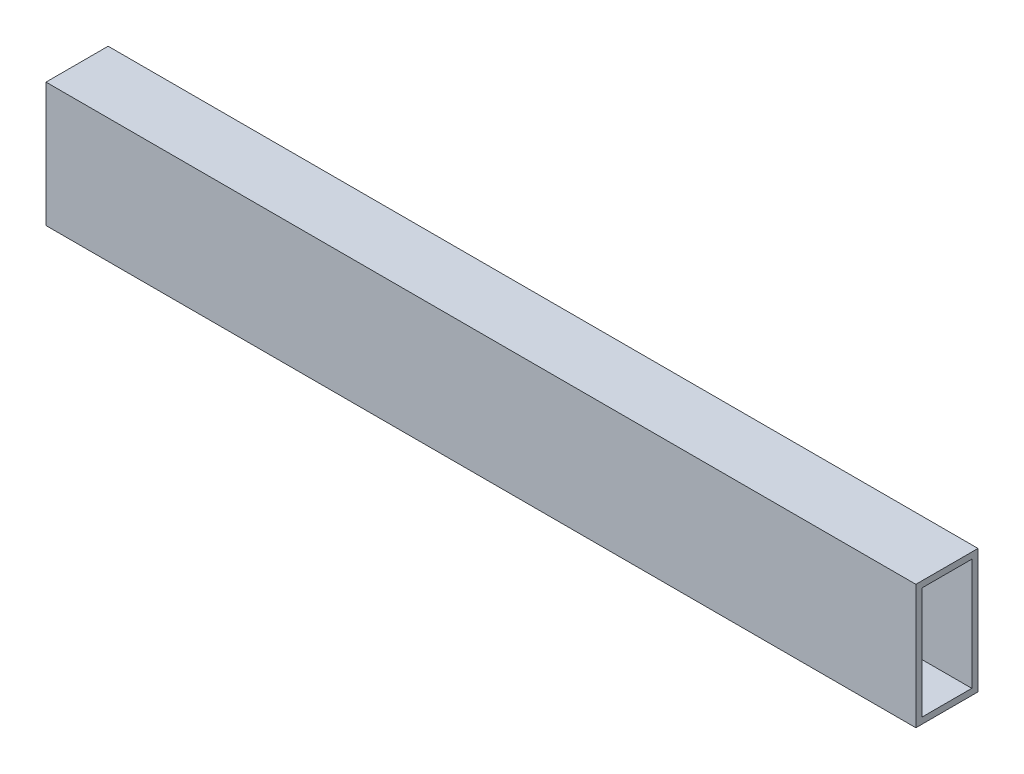
ISO-10303-21;
HEADER;
FILE_DESCRIPTION(('STEP AP214'),'2;1');
FILE_NAME('part.step','',(''),(''),'','','');
FILE_SCHEMA(('AUTOMOTIVE_DESIGN { 1 0 10303 214 1 1 1 1 }'));
ENDSEC;
DATA;
#1=APPLICATION_CONTEXT('core data for automotive mechanical design processes');
#2=APPLICATION_PROTOCOL_DEFINITION('international standard','automotive_design',2000,#1);
#3=PRODUCT_CONTEXT('',#1,'mechanical');
#4=PRODUCT('Part','Part','',(#3));
#5=PRODUCT_RELATED_PRODUCT_CATEGORY('part','',(#4));
#6=PRODUCT_DEFINITION_FORMATION('','',#4);
#7=PRODUCT_DEFINITION_CONTEXT('part definition',#1,'design');
#8=PRODUCT_DEFINITION('design','',#6,#7);
#9=PRODUCT_DEFINITION_SHAPE('','',#8);
#10=(LENGTH_UNIT() NAMED_UNIT(*) SI_UNIT(.MILLI.,.METRE.));
#11=(NAMED_UNIT(*) PLANE_ANGLE_UNIT() SI_UNIT($,.RADIAN.));
#12=(NAMED_UNIT(*) SI_UNIT($,.STERADIAN.) SOLID_ANGLE_UNIT());
#13=UNCERTAINTY_MEASURE_WITH_UNIT(LENGTH_MEASURE(1.E-05),#10,'distance_accuracy_value','');
#14=(GEOMETRIC_REPRESENTATION_CONTEXT(3) GLOBAL_UNCERTAINTY_ASSIGNED_CONTEXT((#13)) GLOBAL_UNIT_ASSIGNED_CONTEXT((#10,
#11,#12)) REPRESENTATION_CONTEXT('',''));
#15=CARTESIAN_POINT('',(0.,0.,0.));
#16=DIRECTION('',(0.,0.,1.));
#17=DIRECTION('',(1.,0.,0.));
#18=AXIS2_PLACEMENT_3D('',#15,#16,#17);
#19=CARTESIAN_POINT('',(700.,0.,0.));
#20=DIRECTION('',(-1.,0.,0.));
#21=DIRECTION('',(0.,0.,1.));
#22=AXIS2_PLACEMENT_3D('',#19,#20,#21);
#23=PLANE('',#22);
#24=DIRECTION('',(0.,-1.,0.));
#25=VECTOR('',#24,1.);
#26=CARTESIAN_POINT('',(700.,0.,0.));
#27=LINE('',#26,#25);
#28=CARTESIAN_POINT('',(700.,100.,0.));
#29=VERTEX_POINT('',#28);
#30=CARTESIAN_POINT('',(700.,0.,0.));
#31=VERTEX_POINT('',#30);
#32=EDGE_CURVE('E135',#29,#31,#27,.T.);
#33=ORIENTED_EDGE('',*,*,#32,.T.);
#34=DIRECTION('',(0.,0.,-1.));
#35=VECTOR('',#34,1.);
#36=CARTESIAN_POINT('',(700.,0.,0.));
#37=LINE('',#36,#35);
#38=CARTESIAN_POINT('',(700.,0.,-50.));
#39=VERTEX_POINT('',#38);
#40=EDGE_CURVE('E138',#31,#39,#37,.T.);
#41=ORIENTED_EDGE('',*,*,#40,.T.);
#42=DIRECTION('',(0.,1.,0.));
#43=VECTOR('',#42,1.);
#44=CARTESIAN_POINT('',(700.,0.,-50.));
#45=LINE('',#44,#43);
#46=CARTESIAN_POINT('',(700.,100.,-50.));
#47=VERTEX_POINT('',#46);
#48=EDGE_CURVE('E141',#39,#47,#45,.T.);
#49=ORIENTED_EDGE('',*,*,#48,.T.);
#50=DIRECTION('',(0.,0.,1.));
#51=VECTOR('',#50,1.);
#52=CARTESIAN_POINT('',(700.,100.,0.));
#53=LINE('',#52,#51);
#54=EDGE_CURVE('E143',#47,#29,#53,.T.);
#55=ORIENTED_EDGE('',*,*,#54,.T.);
#56=EDGE_LOOP('',(#33,#41,#49,#55));
#57=FACE_BOUND('',#56,.T.);
#58=DIRECTION('',(0.,0.,-1.));
#59=VECTOR('',#58,1.);
#60=CARTESIAN_POINT('',(700.,5.,-5.));
#61=LINE('',#60,#59);
#62=CARTESIAN_POINT('',(700.,5.,-5.));
#63=VERTEX_POINT('',#62);
#64=CARTESIAN_POINT('',(700.,5.,-45.));
#65=VERTEX_POINT('',#64);
#66=EDGE_CURVE('E99',#63,#65,#61,.T.);
#67=ORIENTED_EDGE('',*,*,#66,.F.);
#68=DIRECTION('',(0.,-1.,0.));
#69=VECTOR('',#68,1.);
#70=CARTESIAN_POINT('',(700.,5.,-5.));
#71=LINE('',#70,#69);
#72=CARTESIAN_POINT('',(700.,95.,-5.));
#73=VERTEX_POINT('',#72);
#74=EDGE_CURVE('E121',#73,#63,#71,.T.);
#75=ORIENTED_EDGE('',*,*,#74,.F.);
#76=DIRECTION('',(0.,0.,1.));
#77=VECTOR('',#76,1.);
#78=CARTESIAN_POINT('',(700.,95.,-5.));
#79=LINE('',#78,#77);
#80=CARTESIAN_POINT('',(700.,95.,-45.));
#81=VERTEX_POINT('',#80);
#82=EDGE_CURVE('E119',#81,#73,#79,.T.);
#83=ORIENTED_EDGE('',*,*,#82,.F.);
#84=DIRECTION('',(0.,1.,0.));
#85=VECTOR('',#84,1.);
#86=CARTESIAN_POINT('',(700.,5.,-45.));
#87=LINE('',#86,#85);
#88=EDGE_CURVE('E107',#65,#81,#87,.T.);
#89=ORIENTED_EDGE('',*,*,#88,.F.);
#90=EDGE_LOOP('',(#67,#75,#83,#89));
#91=FACE_BOUND('',#90,.T.);
#92=ADVANCED_FACE('F34',(#57,#91),#23,.F.);
#93=CARTESIAN_POINT('',(0.,0.,0.));
#94=DIRECTION('',(-1.,0.,0.));
#95=DIRECTION('',(0.,0.,1.));
#96=AXIS2_PLACEMENT_3D('',#93,#94,#95);
#97=PLANE('',#96);
#98=DIRECTION('',(0.,-1.,0.));
#99=VECTOR('',#98,1.);
#100=CARTESIAN_POINT('',(0.,0.,0.));
#101=LINE('',#100,#99);
#102=CARTESIAN_POINT('',(0.,100.,0.));
#103=VERTEX_POINT('',#102);
#104=CARTESIAN_POINT('',(0.,0.,0.));
#105=VERTEX_POINT('',#104);
#106=EDGE_CURVE('E115',#103,#105,#101,.T.);
#107=ORIENTED_EDGE('',*,*,#106,.F.);
#108=DIRECTION('',(0.,0.,1.));
#109=VECTOR('',#108,1.);
#110=CARTESIAN_POINT('',(0.,100.,0.));
#111=LINE('',#110,#109);
#112=CARTESIAN_POINT('',(0.,100.,-50.));
#113=VERTEX_POINT('',#112);
#114=EDGE_CURVE('E139',#113,#103,#111,.T.);
#115=ORIENTED_EDGE('',*,*,#114,.F.);
#116=DIRECTION('',(0.,1.,0.));
#117=VECTOR('',#116,1.);
#118=CARTESIAN_POINT('',(0.,0.,-50.));
#119=LINE('',#118,#117);
#120=CARTESIAN_POINT('',(0.,0.,-50.));
#121=VERTEX_POINT('',#120);
#122=EDGE_CURVE('E150',#121,#113,#119,.T.);
#123=ORIENTED_EDGE('',*,*,#122,.F.);
#124=DIRECTION('',(0.,0.,-1.));
#125=VECTOR('',#124,1.);
#126=CARTESIAN_POINT('',(0.,0.,0.));
#127=LINE('',#126,#125);
#128=EDGE_CURVE('E148',#105,#121,#127,.T.);
#129=ORIENTED_EDGE('',*,*,#128,.F.);
#130=EDGE_LOOP('',(#107,#115,#123,#129));
#131=FACE_BOUND('',#130,.T.);
#132=DIRECTION('',(0.,-1.,0.));
#133=VECTOR('',#132,1.);
#134=CARTESIAN_POINT('',(0.,5.,-5.));
#135=LINE('',#134,#133);
#136=CARTESIAN_POINT('',(0.,95.,-5.));
#137=VERTEX_POINT('',#136);
#138=CARTESIAN_POINT('',(0.,5.,-5.));
#139=VERTEX_POINT('',#138);
#140=EDGE_CURVE('E108',#137,#139,#135,.T.);
#141=ORIENTED_EDGE('',*,*,#140,.T.);
#142=DIRECTION('',(0.,0.,-1.));
#143=VECTOR('',#142,1.);
#144=CARTESIAN_POINT('',(0.,5.,-5.));
#145=LINE('',#144,#143);
#146=CARTESIAN_POINT('',(0.,5.,-45.));
#147=VERTEX_POINT('',#146);
#148=EDGE_CURVE('E57',#139,#147,#145,.T.);
#149=ORIENTED_EDGE('',*,*,#148,.T.);
#150=DIRECTION('',(0.,1.,0.));
#151=VECTOR('',#150,1.);
#152=CARTESIAN_POINT('',(0.,5.,-45.));
#153=LINE('',#152,#151);
#154=CARTESIAN_POINT('',(0.,95.,-45.));
#155=VERTEX_POINT('',#154);
#156=EDGE_CURVE('E114',#147,#155,#153,.T.);
#157=ORIENTED_EDGE('',*,*,#156,.T.);
#158=DIRECTION('',(0.,0.,1.));
#159=VECTOR('',#158,1.);
#160=CARTESIAN_POINT('',(0.,95.,-5.));
#161=LINE('',#160,#159);
#162=EDGE_CURVE('E127',#155,#137,#161,.T.);
#163=ORIENTED_EDGE('',*,*,#162,.T.);
#164=EDGE_LOOP('',(#141,#149,#157,#163));
#165=FACE_BOUND('',#164,.T.);
#166=ADVANCED_FACE('F168',(#131,#165),#97,.T.);
#167=CARTESIAN_POINT('',(700.,0.,0.));
#168=DIRECTION('',(0.,0.,-1.));
#169=DIRECTION('',(-1.,0.,0.));
#170=AXIS2_PLACEMENT_3D('',#167,#168,#169);
#171=PLANE('',#170);
#172=ORIENTED_EDGE('',*,*,#106,.T.);
#173=DIRECTION('',(-1.,0.,0.));
#174=VECTOR('',#173,1.);
#175=CARTESIAN_POINT('',(700.,0.,0.));
#176=LINE('',#175,#174);
#177=EDGE_CURVE('E11',#31,#105,#176,.T.);
#178=ORIENTED_EDGE('',*,*,#177,.F.);
#179=ORIENTED_EDGE('',*,*,#32,.F.);
#180=DIRECTION('',(-1.,0.,0.));
#181=VECTOR('',#180,1.);
#182=CARTESIAN_POINT('',(700.,100.,0.));
#183=LINE('',#182,#181);
#184=EDGE_CURVE('E145',#29,#103,#183,.T.);
#185=ORIENTED_EDGE('',*,*,#184,.T.);
#186=EDGE_LOOP('',(#172,#178,#179,#185));
#187=FACE_BOUND('',#186,.T.);
#188=ADVANCED_FACE('F36',(#187),#171,.F.);
#189=CARTESIAN_POINT('',(700.,0.,0.));
#190=DIRECTION('',(0.,1.,0.));
#191=DIRECTION('',(0.,0.,1.));
#192=AXIS2_PLACEMENT_3D('',#189,#190,#191);
#193=PLANE('',#192);
#194=ORIENTED_EDGE('',*,*,#128,.T.);
#195=DIRECTION('',(-1.,0.,0.));
#196=VECTOR('',#195,1.);
#197=CARTESIAN_POINT('',(700.,0.,-50.));
#198=LINE('',#197,#196);
#199=EDGE_CURVE('E42',#39,#121,#198,.T.);
#200=ORIENTED_EDGE('',*,*,#199,.F.);
#201=ORIENTED_EDGE('',*,*,#40,.F.);
#202=ORIENTED_EDGE('',*,*,#177,.T.);
#203=EDGE_LOOP('',(#194,#200,#201,#202));
#204=FACE_BOUND('',#203,.T.);
#205=ADVANCED_FACE('F178',(#204),#193,.F.);
#206=CARTESIAN_POINT('',(700.,0.,-50.));
#207=DIRECTION('',(0.,0.,1.));
#208=DIRECTION('',(1.,0.,0.));
#209=AXIS2_PLACEMENT_3D('',#206,#207,#208);
#210=PLANE('',#209);
#211=ORIENTED_EDGE('',*,*,#122,.T.);
#212=DIRECTION('',(-1.,0.,0.));
#213=VECTOR('',#212,1.);
#214=CARTESIAN_POINT('',(700.,100.,-50.));
#215=LINE('',#214,#213);
#216=EDGE_CURVE('E155',#47,#113,#215,.T.);
#217=ORIENTED_EDGE('',*,*,#216,.F.);
#218=ORIENTED_EDGE('',*,*,#48,.F.);
#219=ORIENTED_EDGE('',*,*,#199,.T.);
#220=EDGE_LOOP('',(#211,#217,#218,#219));
#221=FACE_BOUND('',#220,.T.);
#222=ADVANCED_FACE('F162',(#221),#210,.F.);
#223=CARTESIAN_POINT('',(700.,100.,0.));
#224=DIRECTION('',(0.,-1.,0.));
#225=DIRECTION('',(0.,0.,-1.));
#226=AXIS2_PLACEMENT_3D('',#223,#224,#225);
#227=PLANE('',#226);
#228=ORIENTED_EDGE('',*,*,#114,.T.);
#229=ORIENTED_EDGE('',*,*,#184,.F.);
#230=ORIENTED_EDGE('',*,*,#54,.F.);
#231=ORIENTED_EDGE('',*,*,#216,.T.);
#232=EDGE_LOOP('',(#228,#229,#230,#231));
#233=FACE_BOUND('',#232,.T.);
#234=ADVANCED_FACE('F172',(#233),#227,.F.);
#235=CARTESIAN_POINT('',(700.,5.,-5.));
#236=DIRECTION('',(0.,1.,0.));
#237=DIRECTION('',(0.,0.,1.));
#238=AXIS2_PLACEMENT_3D('',#235,#236,#237);
#239=PLANE('',#238);
#240=ORIENTED_EDGE('',*,*,#148,.F.);
#241=DIRECTION('',(-1.,0.,0.));
#242=VECTOR('',#241,1.);
#243=CARTESIAN_POINT('',(700.,5.,-5.));
#244=LINE('',#243,#242);
#245=EDGE_CURVE('E103',#63,#139,#244,.T.);
#246=ORIENTED_EDGE('',*,*,#245,.F.);
#247=ORIENTED_EDGE('',*,*,#66,.T.);
#248=DIRECTION('',(-1.,0.,0.));
#249=VECTOR('',#248,1.);
#250=CARTESIAN_POINT('',(700.,5.,-45.));
#251=LINE('',#250,#249);
#252=EDGE_CURVE('E102',#65,#147,#251,.T.);
#253=ORIENTED_EDGE('',*,*,#252,.T.);
#254=EDGE_LOOP('',(#240,#246,#247,#253));
#255=FACE_BOUND('',#254,.T.);
#256=ADVANCED_FACE('F101',(#255),#239,.T.);
#257=CARTESIAN_POINT('',(700.,5.,-45.));
#258=DIRECTION('',(0.,0.,1.));
#259=DIRECTION('',(1.,0.,0.));
#260=AXIS2_PLACEMENT_3D('',#257,#258,#259);
#261=PLANE('',#260);
#262=ORIENTED_EDGE('',*,*,#156,.F.);
#263=ORIENTED_EDGE('',*,*,#252,.F.);
#264=ORIENTED_EDGE('',*,*,#88,.T.);
#265=DIRECTION('',(-1.,0.,0.));
#266=VECTOR('',#265,1.);
#267=CARTESIAN_POINT('',(700.,95.,-45.));
#268=LINE('',#267,#266);
#269=EDGE_CURVE('E116',#81,#155,#268,.T.);
#270=ORIENTED_EDGE('',*,*,#269,.T.);
#271=EDGE_LOOP('',(#262,#263,#264,#270));
#272=FACE_BOUND('',#271,.T.);
#273=ADVANCED_FACE('F111',(#272),#261,.T.);
#274=CARTESIAN_POINT('',(700.,95.,-5.));
#275=DIRECTION('',(0.,-1.,0.));
#276=DIRECTION('',(0.,0.,-1.));
#277=AXIS2_PLACEMENT_3D('',#274,#275,#276);
#278=PLANE('',#277);
#279=ORIENTED_EDGE('',*,*,#162,.F.);
#280=ORIENTED_EDGE('',*,*,#269,.F.);
#281=ORIENTED_EDGE('',*,*,#82,.T.);
#282=DIRECTION('',(-1.,0.,0.));
#283=VECTOR('',#282,1.);
#284=CARTESIAN_POINT('',(700.,95.,-5.));
#285=LINE('',#284,#283);
#286=EDGE_CURVE('E49',#73,#137,#285,.T.);
#287=ORIENTED_EDGE('',*,*,#286,.T.);
#288=EDGE_LOOP('',(#279,#280,#281,#287));
#289=FACE_BOUND('',#288,.T.);
#290=ADVANCED_FACE('F201',(#289),#278,.T.);
#291=CARTESIAN_POINT('',(700.,5.,-5.));
#292=DIRECTION('',(0.,0.,-1.));
#293=DIRECTION('',(-1.,0.,0.));
#294=AXIS2_PLACEMENT_3D('',#291,#292,#293);
#295=PLANE('',#294);
#296=ORIENTED_EDGE('',*,*,#140,.F.);
#297=ORIENTED_EDGE('',*,*,#286,.F.);
#298=ORIENTED_EDGE('',*,*,#74,.T.);
#299=ORIENTED_EDGE('',*,*,#245,.T.);
#300=EDGE_LOOP('',(#296,#297,#298,#299));
#301=FACE_BOUND('',#300,.T.);
#302=ADVANCED_FACE('F205',(#301),#295,.T.);
#303=CLOSED_SHELL('',(#92,#166,#188,#205,#222,#234,#256,#273,#290,#302));
#304=MANIFOLD_SOLID_BREP('B2',#303);
#305=ADVANCED_BREP_SHAPE_REPRESENTATION('',(#18,#304),#14);
#306=SHAPE_DEFINITION_REPRESENTATION(#9,#305);
ENDSEC;
END-ISO-10303-21;
